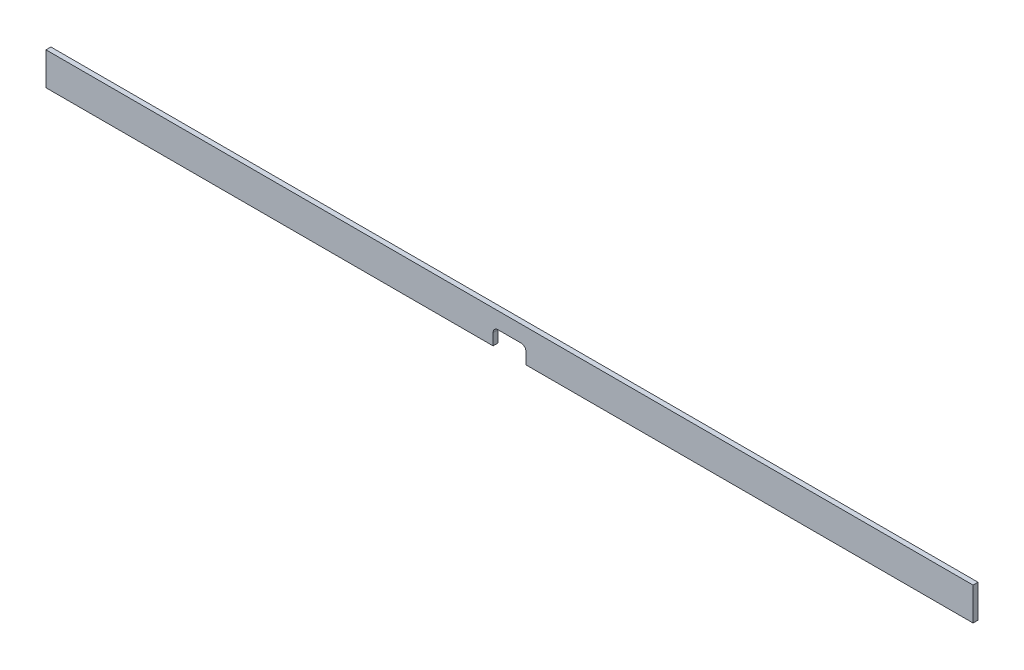
ISO-10303-21;
HEADER;
FILE_DESCRIPTION(('STEP AP214'),'2;1');
FILE_NAME('part.step','',(''),(''),'','','');
FILE_SCHEMA(('AUTOMOTIVE_DESIGN { 1 0 10303 214 1 1 1 1 }'));
ENDSEC;
DATA;
#1=APPLICATION_CONTEXT('core data for automotive mechanical design processes');
#2=APPLICATION_PROTOCOL_DEFINITION('international standard','automotive_design',2000,#1);
#3=PRODUCT_CONTEXT('',#1,'mechanical');
#4=PRODUCT('Part','Part','',(#3));
#5=PRODUCT_RELATED_PRODUCT_CATEGORY('part','',(#4));
#6=PRODUCT_DEFINITION_FORMATION('','',#4);
#7=PRODUCT_DEFINITION_CONTEXT('part definition',#1,'design');
#8=PRODUCT_DEFINITION('design','',#6,#7);
#9=PRODUCT_DEFINITION_SHAPE('','',#8);
#10=(LENGTH_UNIT() NAMED_UNIT(*) SI_UNIT(.MILLI.,.METRE.));
#11=(NAMED_UNIT(*) PLANE_ANGLE_UNIT() SI_UNIT($,.RADIAN.));
#12=(NAMED_UNIT(*) SI_UNIT($,.STERADIAN.) SOLID_ANGLE_UNIT());
#13=UNCERTAINTY_MEASURE_WITH_UNIT(LENGTH_MEASURE(1.E-05),#10,'distance_accuracy_value','');
#14=(GEOMETRIC_REPRESENTATION_CONTEXT(3) GLOBAL_UNCERTAINTY_ASSIGNED_CONTEXT((#13)) GLOBAL_UNIT_ASSIGNED_CONTEXT((#10,
#11,#12)) REPRESENTATION_CONTEXT('',''));
#15=CARTESIAN_POINT('',(0.,0.,0.));
#16=DIRECTION('',(0.,0.,1.));
#17=DIRECTION('',(1.,0.,0.));
#18=AXIS2_PLACEMENT_3D('',#15,#16,#17);
#19=CARTESIAN_POINT('',(-10.,0.,3.));
#20=DIRECTION('',(-1.,0.,0.));
#21=DIRECTION('',(0.,0.,1.));
#22=AXIS2_PLACEMENT_3D('',#19,#20,#21);
#23=PLANE('',#22);
#24=DIRECTION('',(0.,1.,0.));
#25=VECTOR('',#24,1.);
#26=CARTESIAN_POINT('',(-10.,0.,0.));
#27=LINE('',#26,#25);
#28=CARTESIAN_POINT('',(-10.,-10.,0.));
#29=VERTEX_POINT('',#28);
#30=CARTESIAN_POINT('',(-10.,-3.00000000000005,0.));
#31=VERTEX_POINT('',#30);
#32=EDGE_CURVE('E142',#29,#31,#27,.T.);
#33=ORIENTED_EDGE('',*,*,#32,.T.);
#34=DIRECTION('',(0.,0.,-1.));
#35=VECTOR('',#34,1.);
#36=CARTESIAN_POINT('',(-10.,-3.00000000000005,3.));
#37=LINE('',#36,#35);
#38=CARTESIAN_POINT('',(-10.,-3.00000000000005,3.));
#39=VERTEX_POINT('',#38);
#40=EDGE_CURVE('E11',#39,#31,#37,.T.);
#41=ORIENTED_EDGE('',*,*,#40,.F.);
#42=DIRECTION('',(0.,1.,0.));
#43=VECTOR('',#42,1.);
#44=CARTESIAN_POINT('',(-10.,0.,3.));
#45=LINE('',#44,#43);
#46=CARTESIAN_POINT('',(-10.,-10.,3.));
#47=VERTEX_POINT('',#46);
#48=EDGE_CURVE('E207',#47,#39,#45,.T.);
#49=ORIENTED_EDGE('',*,*,#48,.F.);
#50=DIRECTION('',(0.,0.,-1.));
#51=VECTOR('',#50,1.);
#52=CARTESIAN_POINT('',(-10.,-10.,3.));
#53=LINE('',#52,#51);
#54=EDGE_CURVE('E163',#47,#29,#53,.T.);
#55=ORIENTED_EDGE('',*,*,#54,.T.);
#56=EDGE_LOOP('',(#33,#41,#49,#55));
#57=FACE_BOUND('',#56,.T.);
#58=ADVANCED_FACE('F35',(#57),#23,.F.);
#59=CARTESIAN_POINT('',(-7.,-3.00000000000005,3.));
#60=DIRECTION('',(0.,0.,-1.));
#61=DIRECTION('',(-1.,0.,0.));
#62=AXIS2_PLACEMENT_3D('',#59,#60,#61);
#63=CYLINDRICAL_SURFACE('',#62,3.);
#64=CARTESIAN_POINT('',(-7.,-3.00000000000005,0.));
#65=DIRECTION('',(0.,0.,1.));
#66=DIRECTION('',(1.,0.,0.));
#67=AXIS2_PLACEMENT_3D('',#64,#65,#66);
#68=CIRCLE('',#67,3.);
#69=CARTESIAN_POINT('',(-7.,0.,0.));
#70=VERTEX_POINT('',#69);
#71=EDGE_CURVE('E145',#31,#70,#68,.F.);
#72=ORIENTED_EDGE('',*,*,#71,.T.);
#73=DIRECTION('',(0.,0.,-1.));
#74=VECTOR('',#73,1.);
#75=CARTESIAN_POINT('',(-7.,0.,3.));
#76=LINE('',#75,#74);
#77=CARTESIAN_POINT('',(-7.,0.,3.));
#78=VERTEX_POINT('',#77);
#79=EDGE_CURVE('E43',#78,#70,#76,.T.);
#80=ORIENTED_EDGE('',*,*,#79,.F.);
#81=CARTESIAN_POINT('',(-7.,-3.00000000000005,3.));
#82=DIRECTION('',(0.,0.,1.));
#83=DIRECTION('',(1.,0.,0.));
#84=AXIS2_PLACEMENT_3D('',#81,#82,#83);
#85=CIRCLE('',#84,3.);
#86=EDGE_CURVE('E99',#39,#78,#85,.F.);
#87=ORIENTED_EDGE('',*,*,#86,.F.);
#88=ORIENTED_EDGE('',*,*,#40,.T.);
#89=EDGE_LOOP('',(#72,#80,#87,#88));
#90=FACE_BOUND('',#89,.T.);
#91=ADVANCED_FACE('F212',(#90),#63,.F.);
#92=CARTESIAN_POINT('',(0.,0.,3.));
#93=DIRECTION('',(0.,1.,0.));
#94=DIRECTION('',(-1.,0.,0.));
#95=AXIS2_PLACEMENT_3D('',#92,#93,#94);
#96=PLANE('',#95);
#97=DIRECTION('',(1.,0.,0.));
#98=VECTOR('',#97,1.);
#99=CARTESIAN_POINT('',(0.,0.,0.));
#100=LINE('',#99,#98);
#101=CARTESIAN_POINT('',(7.,0.,0.));
#102=VERTEX_POINT('',#101);
#103=EDGE_CURVE('E147',#70,#102,#100,.T.);
#104=ORIENTED_EDGE('',*,*,#103,.T.);
#105=DIRECTION('',(0.,0.,-1.));
#106=VECTOR('',#105,1.);
#107=CARTESIAN_POINT('',(7.,0.,3.));
#108=LINE('',#107,#106);
#109=CARTESIAN_POINT('',(7.,0.,3.));
#110=VERTEX_POINT('',#109);
#111=EDGE_CURVE('E173',#110,#102,#108,.T.);
#112=ORIENTED_EDGE('',*,*,#111,.F.);
#113=DIRECTION('',(1.,0.,0.));
#114=VECTOR('',#113,1.);
#115=CARTESIAN_POINT('',(0.,0.,3.));
#116=LINE('',#115,#114);
#117=EDGE_CURVE('E181',#78,#110,#116,.T.);
#118=ORIENTED_EDGE('',*,*,#117,.F.);
#119=ORIENTED_EDGE('',*,*,#79,.T.);
#120=EDGE_LOOP('',(#104,#112,#118,#119));
#121=FACE_BOUND('',#120,.T.);
#122=ADVANCED_FACE('F179',(#121),#96,.F.);
#123=CARTESIAN_POINT('',(7.,-3.00000000000005,3.));
#124=DIRECTION('',(0.,0.,-1.));
#125=DIRECTION('',(-1.,0.,0.));
#126=AXIS2_PLACEMENT_3D('',#123,#124,#125);
#127=CYLINDRICAL_SURFACE('',#126,3.);
#128=CARTESIAN_POINT('',(7.,-3.00000000000005,0.));
#129=DIRECTION('',(0.,0.,1.));
#130=DIRECTION('',(1.,0.,0.));
#131=AXIS2_PLACEMENT_3D('',#128,#129,#130);
#132=CIRCLE('',#131,3.);
#133=CARTESIAN_POINT('',(10.,-3.00000000000005,0.));
#134=VERTEX_POINT('',#133);
#135=EDGE_CURVE('E149',#102,#134,#132,.F.);
#136=ORIENTED_EDGE('',*,*,#135,.T.);
#137=DIRECTION('',(0.,0.,-1.));
#138=VECTOR('',#137,1.);
#139=CARTESIAN_POINT('',(10.,-3.00000000000005,3.));
#140=LINE('',#139,#138);
#141=CARTESIAN_POINT('',(10.,-3.00000000000005,3.));
#142=VERTEX_POINT('',#141);
#143=EDGE_CURVE('E171',#142,#134,#140,.T.);
#144=ORIENTED_EDGE('',*,*,#143,.F.);
#145=CARTESIAN_POINT('',(7.,-3.00000000000005,3.));
#146=DIRECTION('',(0.,0.,1.));
#147=DIRECTION('',(1.,0.,0.));
#148=AXIS2_PLACEMENT_3D('',#145,#146,#147);
#149=CIRCLE('',#148,3.);
#150=EDGE_CURVE('E193',#110,#142,#149,.F.);
#151=ORIENTED_EDGE('',*,*,#150,.F.);
#152=ORIENTED_EDGE('',*,*,#111,.T.);
#153=EDGE_LOOP('',(#136,#144,#151,#152));
#154=FACE_BOUND('',#153,.T.);
#155=ADVANCED_FACE('F190',(#154),#127,.F.);
#156=CARTESIAN_POINT('',(10.,0.,3.));
#157=DIRECTION('',(-1.,0.,0.));
#158=DIRECTION('',(0.,-1.,0.));
#159=AXIS2_PLACEMENT_3D('',#156,#157,#158);
#160=PLANE('',#159);
#161=DIRECTION('',(0.,1.,0.));
#162=VECTOR('',#161,1.);
#163=CARTESIAN_POINT('',(10.,0.,0.));
#164=LINE('',#163,#162);
#165=CARTESIAN_POINT('',(10.,-9.99999999999994,0.));
#166=VERTEX_POINT('',#165);
#167=EDGE_CURVE('E152',#166,#134,#164,.T.);
#168=ORIENTED_EDGE('',*,*,#167,.F.);
#169=DIRECTION('',(0.,0.,-1.));
#170=VECTOR('',#169,1.);
#171=CARTESIAN_POINT('',(10.,-9.99999999999994,3.));
#172=LINE('',#171,#170);
#173=CARTESIAN_POINT('',(10.,-9.99999999999994,3.));
#174=VERTEX_POINT('',#173);
#175=EDGE_CURVE('E169',#174,#166,#172,.T.);
#176=ORIENTED_EDGE('',*,*,#175,.F.);
#177=DIRECTION('',(0.,1.,0.));
#178=VECTOR('',#177,1.);
#179=CARTESIAN_POINT('',(10.,0.,3.));
#180=LINE('',#179,#178);
#181=EDGE_CURVE('E195',#174,#142,#180,.T.);
#182=ORIENTED_EDGE('',*,*,#181,.T.);
#183=ORIENTED_EDGE('',*,*,#143,.T.);
#184=EDGE_LOOP('',(#168,#176,#182,#183));
#185=FACE_BOUND('',#184,.T.);
#186=ADVANCED_FACE('F222',(#185),#160,.T.);
#187=CARTESIAN_POINT('',(0.,-9.99999999999997,3.));
#188=DIRECTION('',(0.,1.,0.));
#189=DIRECTION('',(-1.,0.,0.));
#190=AXIS2_PLACEMENT_3D('',#187,#188,#189);
#191=PLANE('',#190);
#192=DIRECTION('',(1.,0.,0.));
#193=VECTOR('',#192,1.);
#194=CARTESIAN_POINT('',(0.,-9.99999999999997,0.));
#195=LINE('',#194,#193);
#196=CARTESIAN_POINT('',(282.,-9.99999999999993,0.));
#197=VERTEX_POINT('',#196);
#198=EDGE_CURVE('E155',#166,#197,#195,.T.);
#199=ORIENTED_EDGE('',*,*,#198,.T.);
#200=DIRECTION('',(0.,0.,-1.));
#201=VECTOR('',#200,1.);
#202=CARTESIAN_POINT('',(282.,-9.99999999999993,3.));
#203=LINE('',#202,#201);
#204=CARTESIAN_POINT('',(282.,-9.99999999999993,3.));
#205=VERTEX_POINT('',#204);
#206=EDGE_CURVE('E167',#205,#197,#203,.T.);
#207=ORIENTED_EDGE('',*,*,#206,.F.);
#208=DIRECTION('',(1.,0.,0.));
#209=VECTOR('',#208,1.);
#210=CARTESIAN_POINT('',(0.,-9.99999999999997,3.));
#211=LINE('',#210,#209);
#212=EDGE_CURVE('E138',#174,#205,#211,.T.);
#213=ORIENTED_EDGE('',*,*,#212,.F.);
#214=ORIENTED_EDGE('',*,*,#175,.T.);
#215=EDGE_LOOP('',(#199,#207,#213,#214));
#216=FACE_BOUND('',#215,.T.);
#217=ADVANCED_FACE('F203',(#216),#191,.F.);
#218=CARTESIAN_POINT('',(282.,0.,3.));
#219=DIRECTION('',(1.,0.,0.));
#220=DIRECTION('',(0.,0.,-1.));
#221=AXIS2_PLACEMENT_3D('',#218,#219,#220);
#222=PLANE('',#221);
#223=DIRECTION('',(0.,-1.,0.));
#224=VECTOR('',#223,1.);
#225=CARTESIAN_POINT('',(282.,0.,0.));
#226=LINE('',#225,#224);
#227=CARTESIAN_POINT('',(282.,10.0000000000001,0.));
#228=VERTEX_POINT('',#227);
#229=EDGE_CURVE('E158',#228,#197,#226,.T.);
#230=ORIENTED_EDGE('',*,*,#229,.F.);
#231=DIRECTION('',(0.,0.,-1.));
#232=VECTOR('',#231,1.);
#233=CARTESIAN_POINT('',(282.,10.0000000000001,3.));
#234=LINE('',#233,#232);
#235=CARTESIAN_POINT('',(282.,10.0000000000001,3.));
#236=VERTEX_POINT('',#235);
#237=EDGE_CURVE('E127',#236,#228,#234,.T.);
#238=ORIENTED_EDGE('',*,*,#237,.F.);
#239=DIRECTION('',(0.,-1.,0.));
#240=VECTOR('',#239,1.);
#241=CARTESIAN_POINT('',(282.,0.,3.));
#242=LINE('',#241,#240);
#243=EDGE_CURVE('E136',#236,#205,#242,.T.);
#244=ORIENTED_EDGE('',*,*,#243,.T.);
#245=ORIENTED_EDGE('',*,*,#206,.T.);
#246=EDGE_LOOP('',(#230,#238,#244,#245));
#247=FACE_BOUND('',#246,.T.);
#248=ADVANCED_FACE('F206',(#247),#222,.T.);
#249=CARTESIAN_POINT('',(0.,10.,3.));
#250=DIRECTION('',(0.,1.,0.));
#251=DIRECTION('',(-1.,0.,0.));
#252=AXIS2_PLACEMENT_3D('',#249,#250,#251);
#253=PLANE('',#252);
#254=DIRECTION('',(1.,0.,0.));
#255=VECTOR('',#254,1.);
#256=CARTESIAN_POINT('',(0.,10.,0.));
#257=LINE('',#256,#255);
#258=CARTESIAN_POINT('',(-282.,9.99999999999993,0.));
#259=VERTEX_POINT('',#258);
#260=EDGE_CURVE('E126',#259,#228,#257,.T.);
#261=ORIENTED_EDGE('',*,*,#260,.F.);
#262=DIRECTION('',(0.,0.,-1.));
#263=VECTOR('',#262,1.);
#264=CARTESIAN_POINT('',(-282.,9.99999999999993,3.));
#265=LINE('',#264,#263);
#266=CARTESIAN_POINT('',(-282.,9.99999999999993,3.));
#267=VERTEX_POINT('',#266);
#268=EDGE_CURVE('E120',#267,#259,#265,.T.);
#269=ORIENTED_EDGE('',*,*,#268,.F.);
#270=DIRECTION('',(1.,0.,0.));
#271=VECTOR('',#270,1.);
#272=CARTESIAN_POINT('',(0.,10.,3.));
#273=LINE('',#272,#271);
#274=EDGE_CURVE('E124',#267,#236,#273,.T.);
#275=ORIENTED_EDGE('',*,*,#274,.T.);
#276=ORIENTED_EDGE('',*,*,#237,.T.);
#277=EDGE_LOOP('',(#261,#269,#275,#276));
#278=FACE_BOUND('',#277,.T.);
#279=ADVANCED_FACE('F122',(#278),#253,.T.);
#280=CARTESIAN_POINT('',(-282.,0.,3.));
#281=DIRECTION('',(1.,0.,0.));
#282=DIRECTION('',(0.,0.,-1.));
#283=AXIS2_PLACEMENT_3D('',#280,#281,#282);
#284=PLANE('',#283);
#285=DIRECTION('',(0.,-1.,0.));
#286=VECTOR('',#285,1.);
#287=CARTESIAN_POINT('',(-282.,0.,0.));
#288=LINE('',#287,#286);
#289=CARTESIAN_POINT('',(-282.,-10.,0.));
#290=VERTEX_POINT('',#289);
#291=EDGE_CURVE('E85',#259,#290,#288,.T.);
#292=ORIENTED_EDGE('',*,*,#291,.T.);
#293=DIRECTION('',(0.,0.,-1.));
#294=VECTOR('',#293,1.);
#295=CARTESIAN_POINT('',(-282.,-10.,3.));
#296=LINE('',#295,#294);
#297=CARTESIAN_POINT('',(-282.,-10.,3.));
#298=VERTEX_POINT('',#297);
#299=EDGE_CURVE('E128',#298,#290,#296,.T.);
#300=ORIENTED_EDGE('',*,*,#299,.F.);
#301=DIRECTION('',(0.,-1.,0.));
#302=VECTOR('',#301,1.);
#303=CARTESIAN_POINT('',(-282.,0.,3.));
#304=LINE('',#303,#302);
#305=EDGE_CURVE('E130',#267,#298,#304,.T.);
#306=ORIENTED_EDGE('',*,*,#305,.F.);
#307=ORIENTED_EDGE('',*,*,#268,.T.);
#308=EDGE_LOOP('',(#292,#300,#306,#307));
#309=FACE_BOUND('',#308,.T.);
#310=ADVANCED_FACE('F131',(#309),#284,.F.);
#311=EDGE_CURVE('E91',#290,#29,#195,.T.);
#312=ORIENTED_EDGE('',*,*,#311,.T.);
#313=ORIENTED_EDGE('',*,*,#54,.F.);
#314=EDGE_CURVE('E51',#298,#47,#211,.T.);
#315=ORIENTED_EDGE('',*,*,#314,.F.);
#316=ORIENTED_EDGE('',*,*,#299,.T.);
#317=EDGE_LOOP('',(#312,#313,#315,#316));
#318=FACE_BOUND('',#317,.T.);
#319=ADVANCED_FACE('F232',(#318),#191,.F.);
#320=CARTESIAN_POINT('',(0.,0.,3.));
#321=DIRECTION('',(0.,0.,1.));
#322=DIRECTION('',(1.,0.,0.));
#323=AXIS2_PLACEMENT_3D('',#320,#321,#322);
#324=PLANE('',#323);
#325=ORIENTED_EDGE('',*,*,#48,.T.);
#326=ORIENTED_EDGE('',*,*,#86,.T.);
#327=ORIENTED_EDGE('',*,*,#117,.T.);
#328=ORIENTED_EDGE('',*,*,#150,.T.);
#329=ORIENTED_EDGE('',*,*,#181,.F.);
#330=ORIENTED_EDGE('',*,*,#212,.T.);
#331=ORIENTED_EDGE('',*,*,#243,.F.);
#332=ORIENTED_EDGE('',*,*,#274,.F.);
#333=ORIENTED_EDGE('',*,*,#305,.T.);
#334=ORIENTED_EDGE('',*,*,#314,.T.);
#335=EDGE_LOOP('',(#325,#326,#327,#328,#329,#330,#331,#332,#333,#334));
#336=FACE_BOUND('',#335,.T.);
#337=ADVANCED_FACE('F134',(#336),#324,.T.);
#338=CARTESIAN_POINT('',(0.,0.,0.));
#339=DIRECTION('',(0.,0.,1.));
#340=DIRECTION('',(1.,0.,0.));
#341=AXIS2_PLACEMENT_3D('',#338,#339,#340);
#342=PLANE('',#341);
#343=ORIENTED_EDGE('',*,*,#32,.F.);
#344=ORIENTED_EDGE('',*,*,#311,.F.);
#345=ORIENTED_EDGE('',*,*,#291,.F.);
#346=ORIENTED_EDGE('',*,*,#260,.T.);
#347=ORIENTED_EDGE('',*,*,#229,.T.);
#348=ORIENTED_EDGE('',*,*,#198,.F.);
#349=ORIENTED_EDGE('',*,*,#167,.T.);
#350=ORIENTED_EDGE('',*,*,#135,.F.);
#351=ORIENTED_EDGE('',*,*,#103,.F.);
#352=ORIENTED_EDGE('',*,*,#71,.F.);
#353=EDGE_LOOP('',(#343,#344,#345,#346,#347,#348,#349,#350,#351,#352));
#354=FACE_BOUND('',#353,.T.);
#355=ADVANCED_FACE('F185',(#354),#342,.F.);
#356=CLOSED_SHELL('',(#58,#91,#122,#155,#186,#217,#248,#279,#310,#319,#337,#355));
#357=MANIFOLD_SOLID_BREP('B2',#356);
#358=ADVANCED_BREP_SHAPE_REPRESENTATION('',(#18,#357),#14);
#359=SHAPE_DEFINITION_REPRESENTATION(#9,#358);
ENDSEC;
END-ISO-10303-21;
